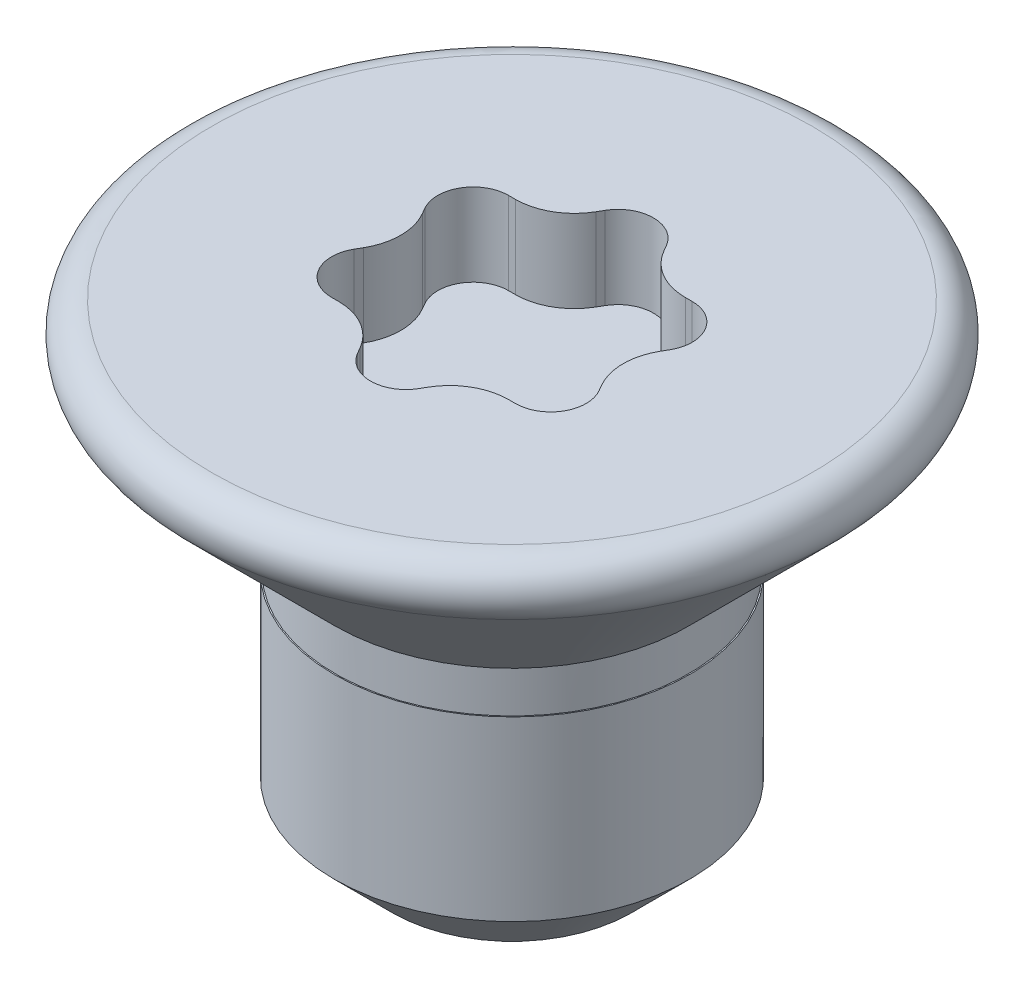
ISO-10303-21;
HEADER;
FILE_DESCRIPTION(('STEP AP214'),'2;1');
FILE_NAME('part.step','',(''),(''),'','','');
FILE_SCHEMA(('AUTOMOTIVE_DESIGN { 1 0 10303 214 1 1 1 1 }'));
ENDSEC;
DATA;
#1=APPLICATION_CONTEXT('core data for automotive mechanical design processes');
#2=APPLICATION_PROTOCOL_DEFINITION('international standard','automotive_design',2000,#1);
#3=PRODUCT_CONTEXT('',#1,'mechanical');
#4=PRODUCT('Part','Part','',(#3));
#5=PRODUCT_RELATED_PRODUCT_CATEGORY('part','',(#4));
#6=PRODUCT_DEFINITION_FORMATION('','',#4);
#7=PRODUCT_DEFINITION_CONTEXT('part definition',#1,'design');
#8=PRODUCT_DEFINITION('design','',#6,#7);
#9=PRODUCT_DEFINITION_SHAPE('','',#8);
#10=(LENGTH_UNIT() NAMED_UNIT(*) SI_UNIT(.MILLI.,.METRE.));
#11=(NAMED_UNIT(*) PLANE_ANGLE_UNIT() SI_UNIT($,.RADIAN.));
#12=(NAMED_UNIT(*) SI_UNIT($,.STERADIAN.) SOLID_ANGLE_UNIT());
#13=UNCERTAINTY_MEASURE_WITH_UNIT(LENGTH_MEASURE(1.E-05),#10,'distance_accuracy_value','');
#14=(GEOMETRIC_REPRESENTATION_CONTEXT(3) GLOBAL_UNCERTAINTY_ASSIGNED_CONTEXT((#13)) GLOBAL_UNIT_ASSIGNED_CONTEXT((#10,
#11,#12)) REPRESENTATION_CONTEXT('',''));
#15=CARTESIAN_POINT('',(0.,0.,0.));
#16=DIRECTION('',(0.,0.,1.));
#17=DIRECTION('',(1.,0.,0.));
#18=AXIS2_PLACEMENT_3D('',#15,#16,#17);
#19=CARTESIAN_POINT('',(0.,-4.,0.));
#20=DIRECTION('',(0.,-1.,0.));
#21=DIRECTION('',(1.,0.,0.));
#22=AXIS2_PLACEMENT_3D('',#19,#20,#21);
#23=PLANE('',#22);
#24=CARTESIAN_POINT('',(0.,-3.99999999996226,0.));
#25=DIRECTION('',(0.,1.,0.));
#26=DIRECTION('',(0.,0.,1.));
#27=AXIS2_PLACEMENT_3D('',#24,#25,#26);
#28=CIRCLE('',#27,1.01414213560247);
#29=CARTESIAN_POINT('',(0.,-3.99999999996226,1.01414213560247));
#30=VERTEX_POINT('',#29);
#31=EDGE_CURVE('E285',#30,#30,#28,.T.);
#32=ORIENTED_EDGE('',*,*,#31,.F.);
#33=EDGE_LOOP('',(#32));
#34=FACE_BOUND('',#33,.T.);
#35=ADVANCED_FACE('F17',(#34),#23,.T.);
#36=CARTESIAN_POINT('',(0.,-3.50414213562544,0.));
#37=DIRECTION('',(0.,1.,0.));
#38=DIRECTION('',(0.,0.,1.));
#39=AXIS2_PLACEMENT_3D('',#36,#37,#38);
#40=CONICAL_SURFACE('',#39,1.50999999993928,0.785398163397448);
#41=ORIENTED_EDGE('',*,*,#31,.T.);
#42=EDGE_LOOP('',(#41));
#43=FACE_BOUND('',#42,.T.);
#44=CARTESIAN_POINT('',(0.,-3.50414213562373,0.));
#45=DIRECTION('',(0.,1.,0.));
#46=DIRECTION('',(0.,0.,1.));
#47=AXIS2_PLACEMENT_3D('',#44,#45,#46);
#48=CIRCLE('',#47,1.51);
#49=CARTESIAN_POINT('',(0.,-3.50414213562373,1.51));
#50=VERTEX_POINT('',#49);
#51=EDGE_CURVE('E282',#50,#50,#48,.T.);
#52=ORIENTED_EDGE('',*,*,#51,.F.);
#53=EDGE_LOOP('',(#52));
#54=FACE_BOUND('',#53,.T.);
#55=ADVANCED_FACE('F747',(#43,#54),#40,.T.);
#56=CARTESIAN_POINT('',(0.,0.,0.));
#57=DIRECTION('',(0.,1.,0.));
#58=DIRECTION('',(0.,0.,1.));
#59=AXIS2_PLACEMENT_3D('',#56,#57,#58);
#60=CYLINDRICAL_SURFACE('',#59,1.51);
#61=ORIENTED_EDGE('',*,*,#51,.T.);
#62=EDGE_LOOP('',(#61));
#63=FACE_BOUND('',#62,.T.);
#64=CARTESIAN_POINT('',(0.,-2.,0.));
#65=DIRECTION('',(0.,1.,0.));
#66=DIRECTION('',(0.,0.,1.));
#67=AXIS2_PLACEMENT_3D('',#64,#65,#66);
#68=CIRCLE('',#67,1.51);
#69=CARTESIAN_POINT('',(0.,-2.,1.51));
#70=VERTEX_POINT('',#69);
#71=EDGE_CURVE('E284',#70,#70,#68,.T.);
#72=ORIENTED_EDGE('',*,*,#71,.F.);
#73=EDGE_LOOP('',(#72));
#74=FACE_BOUND('',#73,.T.);
#75=ADVANCED_FACE('F737',(#63,#74),#60,.T.);
#76=CARTESIAN_POINT('',(-1.5,-2.,0.));
#77=DIRECTION('',(0.,1.,0.));
#78=DIRECTION('',(0.,0.,1.));
#79=AXIS2_PLACEMENT_3D('',#76,#77,#78);
#80=PLANE('',#79);
#81=CARTESIAN_POINT('',(0.,-2.,0.));
#82=DIRECTION('',(0.,1.,0.));
#83=DIRECTION('',(-1.,0.,0.));
#84=AXIS2_PLACEMENT_3D('',#81,#82,#83);
#85=CIRCLE('',#84,1.5);
#86=CARTESIAN_POINT('',(-1.5,-2.,0.));
#87=VERTEX_POINT('',#86);
#88=EDGE_CURVE('E281',#87,#87,#85,.T.);
#89=ORIENTED_EDGE('',*,*,#88,.F.);
#90=EDGE_LOOP('',(#89));
#91=FACE_BOUND('',#90,.T.);
#92=ORIENTED_EDGE('',*,*,#71,.T.);
#93=EDGE_LOOP('',(#92));
#94=FACE_BOUND('',#93,.T.);
#95=ADVANCED_FACE('F727',(#91,#94),#80,.T.);
#96=CARTESIAN_POINT('',(0.,-1.65,0.));
#97=DIRECTION('',(0.,1.,0.));
#98=DIRECTION('',(-1.,0.,0.));
#99=AXIS2_PLACEMENT_3D('',#96,#97,#98);
#100=CYLINDRICAL_SURFACE('',#99,1.5);
#101=CARTESIAN_POINT('',(0.,-1.65000000004056,0.));
#102=DIRECTION('',(0.,1.,0.));
#103=DIRECTION('',(0.,0.,1.));
#104=AXIS2_PLACEMENT_3D('',#101,#102,#103);
#105=CIRCLE('',#104,1.49999999996453);
#106=CARTESIAN_POINT('',(0.,-1.65000000004056,1.49999999996453));
#107=VERTEX_POINT('',#106);
#108=EDGE_CURVE('E278',#107,#107,#105,.T.);
#109=ORIENTED_EDGE('',*,*,#108,.F.);
#110=EDGE_LOOP('',(#109));
#111=FACE_BOUND('',#110,.T.);
#112=ORIENTED_EDGE('',*,*,#88,.T.);
#113=EDGE_LOOP('',(#112));
#114=FACE_BOUND('',#113,.T.);
#115=ADVANCED_FACE('F719',(#111,#114),#100,.T.);
#116=CARTESIAN_POINT('',(0.,-0.426776695405806,0.));
#117=DIRECTION('',(0.,1.,0.));
#118=DIRECTION('',(-1.,0.,0.));
#119=AXIS2_PLACEMENT_3D('',#116,#117,#118);
#120=CONICAL_SURFACE('',#119,2.72322330459929,0.785398163397448);
#121=ORIENTED_EDGE('',*,*,#108,.T.);
#122=EDGE_LOOP('',(#121));
#123=FACE_BOUND('',#122,.T.);
#124=CARTESIAN_POINT('',(0.,-0.426776695296636,0.));
#125=DIRECTION('',(0.,-1.,0.));
#126=DIRECTION('',(0.,0.,-1.));
#127=AXIS2_PLACEMENT_3D('',#124,#125,#126);
#128=CIRCLE('',#127,2.72322330470336);
#129=CARTESIAN_POINT('',(0.,-0.426776695296636,-2.72322330470336));
#130=VERTEX_POINT('',#129);
#131=EDGE_CURVE('E240',#130,#130,#128,.F.);
#132=ORIENTED_EDGE('',*,*,#131,.F.);
#133=EDGE_LOOP('',(#132));
#134=FACE_BOUND('',#133,.T.);
#135=ADVANCED_FACE('F712',(#123,#134),#120,.T.);
#136=CARTESIAN_POINT('',(-0.721687836487033,-0.7,-1.25));
#137=DIRECTION('',(0.,1.,0.));
#138=DIRECTION('',(0.,0.,1.));
#139=AXIS2_PLACEMENT_3D('',#136,#137,#138);
#140=PLANE('',#139);
#141=CARTESIAN_POINT('',(0.,-0.7,-0.900000000000001));
#142=DIRECTION('',(0.,1.,0.));
#143=DIRECTION('',(0.,0.,1.));
#144=AXIS2_PLACEMENT_3D('',#141,#142,#143);
#145=CIRCLE('',#144,0.3);
#146=CARTESIAN_POINT('',(0.259807621135331,-0.7,-1.05));
#147=VERTEX_POINT('',#146);
#148=CARTESIAN_POINT('',(-0.259807621135332,-0.7,-1.05));
#149=VERTEX_POINT('',#148);
#150=EDGE_CURVE('E238',#147,#149,#145,.T.);
#151=ORIENTED_EDGE('',*,*,#150,.T.);
#152=DIRECTION('',(0.5,0.,-0.866025403784438));
#153=VECTOR('',#152,1.);
#154=CARTESIAN_POINT('',(-0.288675134594814,-0.7,-1.));
#155=LINE('',#154,#153);
#156=CARTESIAN_POINT('',(-0.288675134594814,-0.7,-1.));
#157=VERTEX_POINT('',#156);
#158=EDGE_CURVE('E230',#157,#149,#155,.T.);
#159=ORIENTED_EDGE('',*,*,#158,.F.);
#160=CARTESIAN_POINT('',(-0.721687836487033,-0.7,-1.25));
#161=DIRECTION('',(0.,1.,0.));
#162=DIRECTION('',(0.,0.,1.));
#163=AXIS2_PLACEMENT_3D('',#160,#161,#162);
#164=CIRCLE('',#163,0.5);
#165=CARTESIAN_POINT('',(-0.721687836487033,-0.7,-0.75));
#166=VERTEX_POINT('',#165);
#167=EDGE_CURVE('E328',#166,#157,#164,.T.);
#168=ORIENTED_EDGE('',*,*,#167,.F.);
#169=DIRECTION('',(1.,0.,0.));
#170=VECTOR('',#169,1.);
#171=CARTESIAN_POINT('',(-0.779422863405995,-0.7,-0.75));
#172=LINE('',#171,#170);
#173=CARTESIAN_POINT('',(-0.779422863405995,-0.7,-0.75));
#174=VERTEX_POINT('',#173);
#175=EDGE_CURVE('E180',#174,#166,#172,.T.);
#176=ORIENTED_EDGE('',*,*,#175,.F.);
#177=CARTESIAN_POINT('',(-0.779422863405995,-0.7,-0.45));
#178=DIRECTION('',(0.,1.,0.));
#179=DIRECTION('',(0.,0.,1.));
#180=AXIS2_PLACEMENT_3D('',#177,#178,#179);
#181=CIRCLE('',#180,0.3);
#182=CARTESIAN_POINT('',(-1.03923048454133,-0.7,-0.3));
#183=VERTEX_POINT('',#182);
#184=EDGE_CURVE('E194',#174,#183,#181,.T.);
#185=ORIENTED_EDGE('',*,*,#184,.T.);
#186=DIRECTION('',(-0.500000000000001,0.,-0.866025403784438));
#187=VECTOR('',#186,1.);
#188=CARTESIAN_POINT('',(-1.01036297108185,-0.7,-0.25));
#189=LINE('',#188,#187);
#190=CARTESIAN_POINT('',(-1.01036297108185,-0.7,-0.25));
#191=VERTEX_POINT('',#190);
#192=EDGE_CURVE('E186',#191,#183,#189,.T.);
#193=ORIENTED_EDGE('',*,*,#192,.F.);
#194=CARTESIAN_POINT('',(-1.44337567297407,-0.7,0.));
#195=DIRECTION('',(0.,1.,0.));
#196=DIRECTION('',(0.,0.,1.));
#197=AXIS2_PLACEMENT_3D('',#194,#195,#196);
#198=CIRCLE('',#197,0.5);
#199=CARTESIAN_POINT('',(-1.01036297108185,-0.7,0.249999999999999));
#200=VERTEX_POINT('',#199);
#201=EDGE_CURVE('E206',#200,#191,#198,.T.);
#202=ORIENTED_EDGE('',*,*,#201,.F.);
#203=DIRECTION('',(0.499999999999995,0.,-0.866025403784441));
#204=VECTOR('',#203,1.);
#205=CARTESIAN_POINT('',(-1.03923048454133,-0.7,0.300000000000001));
#206=LINE('',#205,#204);
#207=CARTESIAN_POINT('',(-1.03923048454133,-0.7,0.300000000000001));
#208=VERTEX_POINT('',#207);
#209=EDGE_CURVE('E273',#208,#200,#206,.T.);
#210=ORIENTED_EDGE('',*,*,#209,.F.);
#211=CARTESIAN_POINT('',(-0.779422863405996,-0.7,0.450000000000001));
#212=DIRECTION('',(0.,1.,0.));
#213=DIRECTION('',(0.,0.,1.));
#214=AXIS2_PLACEMENT_3D('',#211,#212,#213);
#215=CIRCLE('',#214,0.3);
#216=CARTESIAN_POINT('',(-0.779422863405997,-0.7,0.75));
#217=VERTEX_POINT('',#216);
#218=EDGE_CURVE('E272',#208,#217,#215,.T.);
#219=ORIENTED_EDGE('',*,*,#218,.T.);
#220=DIRECTION('',(-1.,0.,0.));
#221=VECTOR('',#220,1.);
#222=CARTESIAN_POINT('',(-0.721687836487033,-0.7,0.750000000000001));
#223=LINE('',#222,#221);
#224=CARTESIAN_POINT('',(-0.721687836487031,-0.7,0.750000000000001));
#225=VERTEX_POINT('',#224);
#226=EDGE_CURVE('E269',#225,#217,#223,.T.);
#227=ORIENTED_EDGE('',*,*,#226,.F.);
#228=CARTESIAN_POINT('',(-0.721687836487033,-0.7,1.25));
#229=DIRECTION('',(0.,1.,0.));
#230=DIRECTION('',(0.,0.,1.));
#231=AXIS2_PLACEMENT_3D('',#228,#229,#230);
#232=CIRCLE('',#231,0.5);
#233=CARTESIAN_POINT('',(-0.288675134594814,-0.7,1.));
#234=VERTEX_POINT('',#233);
#235=EDGE_CURVE('E348',#234,#225,#232,.T.);
#236=ORIENTED_EDGE('',*,*,#235,.F.);
#237=DIRECTION('',(-0.500000000000002,0.,-0.866025403784438));
#238=VECTOR('',#237,1.);
#239=CARTESIAN_POINT('',(-0.259807621135332,-0.7,1.05));
#240=LINE('',#239,#238);
#241=CARTESIAN_POINT('',(-0.259807621135331,-0.7,1.05));
#242=VERTEX_POINT('',#241);
#243=EDGE_CURVE('E265',#242,#234,#240,.T.);
#244=ORIENTED_EDGE('',*,*,#243,.F.);
#245=CARTESIAN_POINT('',(0.,-0.7,0.900000000000001));
#246=DIRECTION('',(0.,1.,0.));
#247=DIRECTION('',(0.,0.,1.));
#248=AXIS2_PLACEMENT_3D('',#245,#246,#247);
#249=CIRCLE('',#248,0.3);
#250=CARTESIAN_POINT('',(0.259807621135332,-0.7,1.05));
#251=VERTEX_POINT('',#250);
#252=EDGE_CURVE('E264',#242,#251,#249,.T.);
#253=ORIENTED_EDGE('',*,*,#252,.T.);
#254=DIRECTION('',(-0.499999999999999,0.,0.866025403784439));
#255=VECTOR('',#254,1.);
#256=CARTESIAN_POINT('',(0.288675134594813,-0.7,1.));
#257=LINE('',#256,#255);
#258=CARTESIAN_POINT('',(0.288675134594813,-0.7,1.));
#259=VERTEX_POINT('',#258);
#260=EDGE_CURVE('E261',#259,#251,#257,.T.);
#261=ORIENTED_EDGE('',*,*,#260,.F.);
#262=CARTESIAN_POINT('',(0.721687836487033,-0.7,1.25));
#263=DIRECTION('',(0.,1.,0.));
#264=DIRECTION('',(0.,0.,1.));
#265=AXIS2_PLACEMENT_3D('',#262,#263,#264);
#266=CIRCLE('',#265,0.5);
#267=CARTESIAN_POINT('',(0.721687836487032,-0.7,0.750000000000001));
#268=VERTEX_POINT('',#267);
#269=EDGE_CURVE('E343',#268,#259,#266,.T.);
#270=ORIENTED_EDGE('',*,*,#269,.F.);
#271=DIRECTION('',(-1.,0.,0.));
#272=VECTOR('',#271,1.);
#273=CARTESIAN_POINT('',(0.779422863405995,-0.7,0.750000000000001));
#274=LINE('',#273,#272);
#275=CARTESIAN_POINT('',(0.779422863405995,-0.7,0.750000000000001));
#276=VERTEX_POINT('',#275);
#277=EDGE_CURVE('E257',#276,#268,#274,.T.);
#278=ORIENTED_EDGE('',*,*,#277,.F.);
#279=CARTESIAN_POINT('',(0.779422863405995,-0.7,0.450000000000001));
#280=DIRECTION('',(0.,1.,0.));
#281=DIRECTION('',(0.,0.,1.));
#282=AXIS2_PLACEMENT_3D('',#279,#280,#281);
#283=CIRCLE('',#282,0.3);
#284=CARTESIAN_POINT('',(1.03923048454133,-0.7,0.300000000000001));
#285=VERTEX_POINT('',#284);
#286=EDGE_CURVE('E256',#276,#285,#283,.T.);
#287=ORIENTED_EDGE('',*,*,#286,.T.);
#288=DIRECTION('',(0.499999999999997,0.,0.866025403784441));
#289=VECTOR('',#288,1.);
#290=CARTESIAN_POINT('',(1.01036297108185,-0.7,0.250000000000001));
#291=LINE('',#290,#289);
#292=CARTESIAN_POINT('',(1.01036297108185,-0.7,0.25));
#293=VERTEX_POINT('',#292);
#294=EDGE_CURVE('E253',#293,#285,#291,.T.);
#295=ORIENTED_EDGE('',*,*,#294,.F.);
#296=CARTESIAN_POINT('',(1.44337567297406,-0.7,0.));
#297=DIRECTION('',(0.,1.,0.));
#298=DIRECTION('',(0.,0.,1.));
#299=AXIS2_PLACEMENT_3D('',#296,#297,#298);
#300=CIRCLE('',#299,0.5);
#301=CARTESIAN_POINT('',(1.01036297108185,-0.7,-0.25));
#302=VERTEX_POINT('',#301);
#303=EDGE_CURVE('E338',#302,#293,#300,.T.);
#304=ORIENTED_EDGE('',*,*,#303,.F.);
#305=DIRECTION('',(-0.500000000000003,0.,0.866025403784437));
#306=VECTOR('',#305,1.);
#307=CARTESIAN_POINT('',(1.03923048454133,-0.7,-0.3));
#308=LINE('',#307,#306);
#309=CARTESIAN_POINT('',(1.03923048454133,-0.7,-0.299999999999999));
#310=VERTEX_POINT('',#309);
#311=EDGE_CURVE('E249',#310,#302,#308,.T.);
#312=ORIENTED_EDGE('',*,*,#311,.F.);
#313=CARTESIAN_POINT('',(0.779422863405996,-0.7,-0.45));
#314=DIRECTION('',(0.,1.,0.));
#315=DIRECTION('',(0.,0.,1.));
#316=AXIS2_PLACEMENT_3D('',#313,#314,#315);
#317=CIRCLE('',#316,0.3);
#318=CARTESIAN_POINT('',(0.779422863405996,-0.7,-0.749999999999999));
#319=VERTEX_POINT('',#318);
#320=EDGE_CURVE('E248',#310,#319,#317,.T.);
#321=ORIENTED_EDGE('',*,*,#320,.T.);
#322=DIRECTION('',(1.,0.,0.));
#323=VECTOR('',#322,1.);
#324=CARTESIAN_POINT('',(0.721687836487033,-0.7,-0.749999999999999));
#325=LINE('',#324,#323);
#326=CARTESIAN_POINT('',(0.721687836487033,-0.7,-0.75));
#327=VERTEX_POINT('',#326);
#328=EDGE_CURVE('E245',#327,#319,#325,.T.);
#329=ORIENTED_EDGE('',*,*,#328,.F.);
#330=CARTESIAN_POINT('',(0.721687836487033,-0.7,-1.25));
#331=DIRECTION('',(0.,1.,0.));
#332=DIRECTION('',(0.,0.,1.));
#333=AXIS2_PLACEMENT_3D('',#330,#331,#332);
#334=CIRCLE('',#333,0.5);
#335=CARTESIAN_POINT('',(0.288675134594814,-0.7,-0.999999999999999));
#336=VERTEX_POINT('',#335);
#337=EDGE_CURVE('E333',#336,#327,#334,.T.);
#338=ORIENTED_EDGE('',*,*,#337,.F.);
#339=DIRECTION('',(0.500000000000004,0.,0.866025403784436));
#340=VECTOR('',#339,1.);
#341=CARTESIAN_POINT('',(0.259807621135331,-0.7,-1.05));
#342=LINE('',#341,#340);
#343=EDGE_CURVE('E241',#147,#336,#342,.T.);
#344=ORIENTED_EDGE('',*,*,#343,.F.);
#345=EDGE_LOOP('',(#151,#159,#168,#176,#185,#193,#202,#210,#219,#227,#236,#244,#253,#261,#270,
#278,#287,#295,#304,#312,#321,#329,#338,#344));
#346=FACE_BOUND('',#345,.T.);
#347=ADVANCED_FACE('F197',(#346),#140,.T.);
#348=CARTESIAN_POINT('',(0.,-0.25,0.));
#349=DIRECTION('',(0.,-1.,0.));
#350=DIRECTION('',(0.,0.,-1.));
#351=AXIS2_PLACEMENT_3D('',#348,#349,#350);
#352=TOROIDAL_SURFACE('',#351,2.54644660940672,0.25);
#353=CARTESIAN_POINT('',(0.,0.,0.));
#354=DIRECTION('',(0.,-1.,0.));
#355=DIRECTION('',(0.,0.,-1.));
#356=AXIS2_PLACEMENT_3D('',#353,#354,#355);
#357=CIRCLE('',#356,2.54644660940672);
#358=CARTESIAN_POINT('',(0.,0.,-2.54644660940672));
#359=VERTEX_POINT('',#358);
#360=CARTESIAN_POINT('',(0.,0.,2.54644660940672));
#361=VERTEX_POINT('',#360);
#362=EDGE_CURVE('E360',#359,#361,#357,.T.);
#363=ORIENTED_EDGE('',*,*,#362,.T.);
#364=CARTESIAN_POINT('',(0.,0.,0.));
#365=DIRECTION('',(0.,-1.,0.));
#366=DIRECTION('',(0.,0.,1.));
#367=AXIS2_PLACEMENT_3D('',#364,#365,#366);
#368=CIRCLE('',#367,2.54644660940672);
#369=EDGE_CURVE('E363',#361,#359,#368,.T.);
#370=ORIENTED_EDGE('',*,*,#369,.T.);
#371=EDGE_LOOP('',(#363,#370));
#372=FACE_BOUND('',#371,.T.);
#373=ORIENTED_EDGE('',*,*,#131,.T.);
#374=EDGE_LOOP('',(#373));
#375=FACE_BOUND('',#374,.T.);
#376=ADVANCED_FACE('F217',(#372,#375),#352,.T.);
#377=CARTESIAN_POINT('',(-0.779422863405995,-0.7,-0.75));
#378=DIRECTION('',(0.,0.,1.));
#379=DIRECTION('',(1.,0.,0.));
#380=AXIS2_PLACEMENT_3D('',#377,#378,#379);
#381=PLANE('',#380);
#382=ORIENTED_EDGE('',*,*,#175,.T.);
#383=DIRECTION('',(0.,1.,0.));
#384=VECTOR('',#383,1.);
#385=CARTESIAN_POINT('',(-0.721687836487033,-0.7,-0.75));
#386=LINE('',#385,#384);
#387=CARTESIAN_POINT('',(-0.721687836487033,0.,-0.75));
#388=VERTEX_POINT('',#387);
#389=EDGE_CURVE('E330',#388,#166,#386,.F.);
#390=ORIENTED_EDGE('',*,*,#389,.F.);
#391=DIRECTION('',(1.,0.,0.));
#392=VECTOR('',#391,1.);
#393=CARTESIAN_POINT('',(0.,0.,-0.75));
#394=LINE('',#393,#392);
#395=CARTESIAN_POINT('',(-0.779422863405995,0.,-0.75));
#396=VERTEX_POINT('',#395);
#397=EDGE_CURVE('E327',#388,#396,#394,.F.);
#398=ORIENTED_EDGE('',*,*,#397,.T.);
#399=DIRECTION('',(0.,1.,0.));
#400=VECTOR('',#399,1.);
#401=CARTESIAN_POINT('',(-0.779422863405995,-0.7,-0.75));
#402=LINE('',#401,#400);
#403=EDGE_CURVE('E200',#396,#174,#402,.F.);
#404=ORIENTED_EDGE('',*,*,#403,.T.);
#405=EDGE_LOOP('',(#382,#390,#398,#404));
#406=FACE_BOUND('',#405,.T.);
#407=ADVANCED_FACE('F222',(#406),#381,.T.);
#408=CARTESIAN_POINT('',(-0.779422863405995,-0.7,-0.45));
#409=DIRECTION('',(0.,1.,0.));
#410=DIRECTION('',(0.,0.,1.));
#411=AXIS2_PLACEMENT_3D('',#408,#409,#410);
#412=CYLINDRICAL_SURFACE('',#411,0.3);
#413=DIRECTION('',(0.,1.,0.));
#414=VECTOR('',#413,1.);
#415=CARTESIAN_POINT('',(-1.03923048454133,-0.7,-0.3));
#416=LINE('',#415,#414);
#417=CARTESIAN_POINT('',(-1.03923048454133,0.,-0.3));
#418=VERTEX_POINT('',#417);
#419=EDGE_CURVE('E190',#183,#418,#416,.T.);
#420=ORIENTED_EDGE('',*,*,#419,.F.);
#421=ORIENTED_EDGE('',*,*,#184,.F.);
#422=ORIENTED_EDGE('',*,*,#403,.F.);
#423=CARTESIAN_POINT('',(-0.779422863405995,0.,-0.45));
#424=DIRECTION('',(0.,1.,0.));
#425=DIRECTION('',(0.,0.,1.));
#426=AXIS2_PLACEMENT_3D('',#423,#424,#425);
#427=CIRCLE('',#426,0.3);
#428=EDGE_CURVE('E205',#396,#418,#427,.T.);
#429=ORIENTED_EDGE('',*,*,#428,.T.);
#430=EDGE_LOOP('',(#420,#421,#422,#429));
#431=FACE_BOUND('',#430,.T.);
#432=ADVANCED_FACE('F203',(#431),#412,.F.);
#433=CARTESIAN_POINT('',(-1.01036297108185,-0.7,-0.25));
#434=DIRECTION('',(0.866025403784438,0.,-0.500000000000001));
#435=DIRECTION('',(-0.500000000000001,0.,-0.866025403784438));
#436=AXIS2_PLACEMENT_3D('',#433,#434,#435);
#437=PLANE('',#436);
#438=ORIENTED_EDGE('',*,*,#192,.T.);
#439=ORIENTED_EDGE('',*,*,#419,.T.);
#440=DIRECTION('',(0.499999999999999,0.,0.866025403784439));
#441=VECTOR('',#440,1.);
#442=CARTESIAN_POINT('',(-1.03923048454133,0.,-0.3));
#443=LINE('',#442,#441);
#444=CARTESIAN_POINT('',(-1.01036297108185,0.,-0.249999999999999));
#445=VERTEX_POINT('',#444);
#446=EDGE_CURVE('E325',#418,#445,#443,.T.);
#447=ORIENTED_EDGE('',*,*,#446,.T.);
#448=DIRECTION('',(0.,1.,0.));
#449=VECTOR('',#448,1.);
#450=CARTESIAN_POINT('',(-1.01036297108185,-0.7,-0.25));
#451=LINE('',#450,#449);
#452=EDGE_CURVE('E192',#191,#445,#451,.T.);
#453=ORIENTED_EDGE('',*,*,#452,.F.);
#454=EDGE_LOOP('',(#438,#439,#447,#453));
#455=FACE_BOUND('',#454,.T.);
#456=ADVANCED_FACE('F187',(#455),#437,.T.);
#457=CARTESIAN_POINT('',(-1.44337567297407,-0.7,0.));
#458=DIRECTION('',(0.,1.,0.));
#459=DIRECTION('',(0.,0.,1.));
#460=AXIS2_PLACEMENT_3D('',#457,#458,#459);
#461=CYLINDRICAL_SURFACE('',#460,0.5);
#462=ORIENTED_EDGE('',*,*,#201,.T.);
#463=ORIENTED_EDGE('',*,*,#452,.T.);
#464=CARTESIAN_POINT('',(-1.44337567297407,0.,0.));
#465=DIRECTION('',(0.,1.,0.));
#466=DIRECTION('',(0.,0.,1.));
#467=AXIS2_PLACEMENT_3D('',#464,#465,#466);
#468=CIRCLE('',#467,0.5);
#469=CARTESIAN_POINT('',(-1.01036297108185,0.,0.249999999999999));
#470=VERTEX_POINT('',#469);
#471=EDGE_CURVE('E322',#445,#470,#468,.F.);
#472=ORIENTED_EDGE('',*,*,#471,.T.);
#473=DIRECTION('',(0.,1.,0.));
#474=VECTOR('',#473,1.);
#475=CARTESIAN_POINT('',(-1.01036297108185,-0.7,0.25));
#476=LINE('',#475,#474);
#477=EDGE_CURVE('E274',#200,#470,#476,.T.);
#478=ORIENTED_EDGE('',*,*,#477,.F.);
#479=EDGE_LOOP('',(#462,#463,#472,#478));
#480=FACE_BOUND('',#479,.T.);
#481=ADVANCED_FACE('F408',(#480),#461,.T.);
#482=CARTESIAN_POINT('',(-1.03923048454133,-0.7,0.300000000000001));
#483=DIRECTION('',(0.866025403784441,0.,0.499999999999995));
#484=DIRECTION('',(0.499999999999995,0.,-0.866025403784441));
#485=AXIS2_PLACEMENT_3D('',#482,#483,#484);
#486=PLANE('',#485);
#487=ORIENTED_EDGE('',*,*,#209,.T.);
#488=ORIENTED_EDGE('',*,*,#477,.T.);
#489=DIRECTION('',(-0.499999999999995,0.,0.866025403784441));
#490=VECTOR('',#489,1.);
#491=CARTESIAN_POINT('',(-1.01036297108185,0.,0.25));
#492=LINE('',#491,#490);
#493=CARTESIAN_POINT('',(-1.03923048454133,0.,0.300000000000001));
#494=VERTEX_POINT('',#493);
#495=EDGE_CURVE('E321',#470,#494,#492,.T.);
#496=ORIENTED_EDGE('',*,*,#495,.T.);
#497=DIRECTION('',(0.,1.,0.));
#498=VECTOR('',#497,1.);
#499=CARTESIAN_POINT('',(-1.03923048454133,-0.7,0.300000000000001));
#500=LINE('',#499,#498);
#501=EDGE_CURVE('E351',#494,#208,#500,.F.);
#502=ORIENTED_EDGE('',*,*,#501,.T.);
#503=EDGE_LOOP('',(#487,#488,#496,#502));
#504=FACE_BOUND('',#503,.T.);
#505=ADVANCED_FACE('F399',(#504),#486,.T.);
#506=CARTESIAN_POINT('',(-0.779422863405996,-0.7,0.450000000000001));
#507=DIRECTION('',(0.,1.,0.));
#508=DIRECTION('',(0.,0.,1.));
#509=AXIS2_PLACEMENT_3D('',#506,#507,#508);
#510=CYLINDRICAL_SURFACE('',#509,0.3);
#511=DIRECTION('',(0.,1.,0.));
#512=VECTOR('',#511,1.);
#513=CARTESIAN_POINT('',(-0.779422863405996,-0.7,0.75));
#514=LINE('',#513,#512);
#515=CARTESIAN_POINT('',(-0.779422863405996,0.,0.75));
#516=VERTEX_POINT('',#515);
#517=EDGE_CURVE('E271',#217,#516,#514,.T.);
#518=ORIENTED_EDGE('',*,*,#517,.F.);
#519=ORIENTED_EDGE('',*,*,#218,.F.);
#520=ORIENTED_EDGE('',*,*,#501,.F.);
#521=CARTESIAN_POINT('',(-0.779422863405996,0.,0.450000000000001));
#522=DIRECTION('',(0.,1.,0.));
#523=DIRECTION('',(0.,0.,1.));
#524=AXIS2_PLACEMENT_3D('',#521,#522,#523);
#525=CIRCLE('',#524,0.3);
#526=EDGE_CURVE('E318',#494,#516,#525,.T.);
#527=ORIENTED_EDGE('',*,*,#526,.T.);
#528=EDGE_LOOP('',(#518,#519,#520,#527));
#529=FACE_BOUND('',#528,.T.);
#530=ADVANCED_FACE('F413',(#529),#510,.F.);
#531=CARTESIAN_POINT('',(-0.721687836487033,-0.7,0.750000000000001));
#532=DIRECTION('',(0.,0.,-1.));
#533=DIRECTION('',(-1.,0.,0.));
#534=AXIS2_PLACEMENT_3D('',#531,#532,#533);
#535=PLANE('',#534);
#536=ORIENTED_EDGE('',*,*,#226,.T.);
#537=ORIENTED_EDGE('',*,*,#517,.T.);
#538=DIRECTION('',(1.,0.,0.));
#539=VECTOR('',#538,1.);
#540=CARTESIAN_POINT('',(0.,0.,0.75));
#541=LINE('',#540,#539);
#542=CARTESIAN_POINT('',(-0.721687836487033,0.,0.75));
#543=VERTEX_POINT('',#542);
#544=EDGE_CURVE('E317',#516,#543,#541,.T.);
#545=ORIENTED_EDGE('',*,*,#544,.T.);
#546=DIRECTION('',(0.,1.,0.));
#547=VECTOR('',#546,1.);
#548=CARTESIAN_POINT('',(-0.721687836487033,-0.7,0.750000000000001));
#549=LINE('',#548,#547);
#550=EDGE_CURVE('E268',#225,#543,#549,.T.);
#551=ORIENTED_EDGE('',*,*,#550,.F.);
#552=EDGE_LOOP('',(#536,#537,#545,#551));
#553=FACE_BOUND('',#552,.T.);
#554=ADVANCED_FACE('F416',(#553),#535,.T.);
#555=CARTESIAN_POINT('',(-0.721687836487033,-0.7,1.25));
#556=DIRECTION('',(0.,1.,0.));
#557=DIRECTION('',(0.,0.,1.));
#558=AXIS2_PLACEMENT_3D('',#555,#556,#557);
#559=CYLINDRICAL_SURFACE('',#558,0.5);
#560=ORIENTED_EDGE('',*,*,#235,.T.);
#561=ORIENTED_EDGE('',*,*,#550,.T.);
#562=CARTESIAN_POINT('',(-0.721687836487033,0.,1.25));
#563=DIRECTION('',(0.,1.,0.));
#564=DIRECTION('',(0.,0.,1.));
#565=AXIS2_PLACEMENT_3D('',#562,#563,#564);
#566=CIRCLE('',#565,0.5);
#567=CARTESIAN_POINT('',(-0.288675134594814,0.,1.));
#568=VERTEX_POINT('',#567);
#569=EDGE_CURVE('E314',#543,#568,#566,.F.);
#570=ORIENTED_EDGE('',*,*,#569,.T.);
#571=DIRECTION('',(0.,1.,0.));
#572=VECTOR('',#571,1.);
#573=CARTESIAN_POINT('',(-0.288675134594813,-0.7,1.));
#574=LINE('',#573,#572);
#575=EDGE_CURVE('E267',#234,#568,#574,.T.);
#576=ORIENTED_EDGE('',*,*,#575,.F.);
#577=EDGE_LOOP('',(#560,#561,#570,#576));
#578=FACE_BOUND('',#577,.T.);
#579=ADVANCED_FACE('F472',(#578),#559,.T.);
#580=CARTESIAN_POINT('',(-0.259807621135332,-0.7,1.05));
#581=DIRECTION('',(0.866025403784438,0.,-0.500000000000002));
#582=DIRECTION('',(-0.500000000000002,0.,-0.866025403784438));
#583=AXIS2_PLACEMENT_3D('',#580,#581,#582);
#584=PLANE('',#583);
#585=ORIENTED_EDGE('',*,*,#243,.T.);
#586=ORIENTED_EDGE('',*,*,#575,.T.);
#587=DIRECTION('',(0.500000000000002,0.,0.866025403784438));
#588=VECTOR('',#587,1.);
#589=CARTESIAN_POINT('',(-0.288675134594813,0.,1.));
#590=LINE('',#589,#588);
#591=CARTESIAN_POINT('',(-0.259807621135331,0.,1.05));
#592=VERTEX_POINT('',#591);
#593=EDGE_CURVE('E313',#568,#592,#590,.T.);
#594=ORIENTED_EDGE('',*,*,#593,.T.);
#595=DIRECTION('',(0.,1.,0.));
#596=VECTOR('',#595,1.);
#597=CARTESIAN_POINT('',(-0.259807621135332,-0.7,1.05));
#598=LINE('',#597,#596);
#599=EDGE_CURVE('E347',#592,#242,#598,.F.);
#600=ORIENTED_EDGE('',*,*,#599,.T.);
#601=EDGE_LOOP('',(#585,#586,#594,#600));
#602=FACE_BOUND('',#601,.T.);
#603=ADVANCED_FACE('F469',(#602),#584,.T.);
#604=CARTESIAN_POINT('',(0.,-0.7,0.900000000000001));
#605=DIRECTION('',(0.,1.,0.));
#606=DIRECTION('',(0.,0.,1.));
#607=AXIS2_PLACEMENT_3D('',#604,#605,#606);
#608=CYLINDRICAL_SURFACE('',#607,0.3);
#609=ORIENTED_EDGE('',*,*,#252,.F.);
#610=ORIENTED_EDGE('',*,*,#599,.F.);
#611=CARTESIAN_POINT('',(0.,0.,0.900000000000001));
#612=DIRECTION('',(0.,1.,0.));
#613=DIRECTION('',(0.,0.,1.));
#614=AXIS2_PLACEMENT_3D('',#611,#612,#613);
#615=CIRCLE('',#614,0.3);
#616=CARTESIAN_POINT('',(0.259807621135332,0.,1.05));
#617=VERTEX_POINT('',#616);
#618=EDGE_CURVE('E311',#592,#617,#615,.T.);
#619=ORIENTED_EDGE('',*,*,#618,.T.);
#620=DIRECTION('',(0.,1.,0.));
#621=VECTOR('',#620,1.);
#622=CARTESIAN_POINT('',(0.259807621135332,-0.7,1.05));
#623=LINE('',#622,#621);
#624=EDGE_CURVE('E263',#251,#617,#623,.T.);
#625=ORIENTED_EDGE('',*,*,#624,.F.);
#626=EDGE_LOOP('',(#609,#610,#619,#625));
#627=FACE_BOUND('',#626,.T.);
#628=ADVANCED_FACE('F467',(#627),#608,.F.);
#629=CARTESIAN_POINT('',(0.288675134594813,-0.7,1.));
#630=DIRECTION('',(-0.866025403784439,0.,-0.499999999999999));
#631=DIRECTION('',(-0.499999999999999,0.,0.866025403784439));
#632=AXIS2_PLACEMENT_3D('',#629,#630,#631);
#633=PLANE('',#632);
#634=ORIENTED_EDGE('',*,*,#260,.T.);
#635=ORIENTED_EDGE('',*,*,#624,.T.);
#636=DIRECTION('',(0.499999999999997,0.,-0.86602540378444));
#637=VECTOR('',#636,1.);
#638=CARTESIAN_POINT('',(0.259807621135332,0.,1.05));
#639=LINE('',#638,#637);
#640=CARTESIAN_POINT('',(0.288675134594813,0.,1.));
#641=VERTEX_POINT('',#640);
#642=EDGE_CURVE('E310',#617,#641,#639,.T.);
#643=ORIENTED_EDGE('',*,*,#642,.T.);
#644=DIRECTION('',(0.,1.,0.));
#645=VECTOR('',#644,1.);
#646=CARTESIAN_POINT('',(0.288675134594814,-0.7,1.));
#647=LINE('',#646,#645);
#648=EDGE_CURVE('E260',#259,#641,#647,.T.);
#649=ORIENTED_EDGE('',*,*,#648,.F.);
#650=EDGE_LOOP('',(#634,#635,#643,#649));
#651=FACE_BOUND('',#650,.T.);
#652=ADVANCED_FACE('F452',(#651),#633,.T.);
#653=CARTESIAN_POINT('',(0.721687836487033,-0.7,1.25));
#654=DIRECTION('',(0.,1.,0.));
#655=DIRECTION('',(0.,0.,1.));
#656=AXIS2_PLACEMENT_3D('',#653,#654,#655);
#657=CYLINDRICAL_SURFACE('',#656,0.5);
#658=ORIENTED_EDGE('',*,*,#269,.T.);
#659=ORIENTED_EDGE('',*,*,#648,.T.);
#660=CARTESIAN_POINT('',(0.721687836487033,0.,1.25));
#661=DIRECTION('',(0.,1.,0.));
#662=DIRECTION('',(0.,0.,1.));
#663=AXIS2_PLACEMENT_3D('',#660,#661,#662);
#664=CIRCLE('',#663,0.5);
#665=CARTESIAN_POINT('',(0.721687836487033,0.,0.750000000000001));
#666=VERTEX_POINT('',#665);
#667=EDGE_CURVE('E307',#641,#666,#664,.F.);
#668=ORIENTED_EDGE('',*,*,#667,.T.);
#669=DIRECTION('',(0.,1.,0.));
#670=VECTOR('',#669,1.);
#671=CARTESIAN_POINT('',(0.721687836487033,-0.7,0.750000000000001));
#672=LINE('',#671,#670);
#673=EDGE_CURVE('E259',#268,#666,#672,.T.);
#674=ORIENTED_EDGE('',*,*,#673,.F.);
#675=EDGE_LOOP('',(#658,#659,#668,#674));
#676=FACE_BOUND('',#675,.T.);
#677=ADVANCED_FACE('F461',(#676),#657,.T.);
#678=CARTESIAN_POINT('',(0.779422863405995,-0.7,0.750000000000001));
#679=DIRECTION('',(0.,0.,-1.));
#680=DIRECTION('',(-1.,0.,0.));
#681=AXIS2_PLACEMENT_3D('',#678,#679,#680);
#682=PLANE('',#681);
#683=ORIENTED_EDGE('',*,*,#277,.T.);
#684=ORIENTED_EDGE('',*,*,#673,.T.);
#685=DIRECTION('',(1.,0.,0.));
#686=VECTOR('',#685,1.);
#687=CARTESIAN_POINT('',(0.,0.,0.750000000000001));
#688=LINE('',#687,#686);
#689=CARTESIAN_POINT('',(0.779422863405995,0.,0.750000000000001));
#690=VERTEX_POINT('',#689);
#691=EDGE_CURVE('E306',#666,#690,#688,.T.);
#692=ORIENTED_EDGE('',*,*,#691,.T.);
#693=DIRECTION('',(0.,1.,0.));
#694=VECTOR('',#693,1.);
#695=CARTESIAN_POINT('',(0.779422863405995,-0.7,0.750000000000001));
#696=LINE('',#695,#694);
#697=EDGE_CURVE('E342',#690,#276,#696,.F.);
#698=ORIENTED_EDGE('',*,*,#697,.T.);
#699=EDGE_LOOP('',(#683,#684,#692,#698));
#700=FACE_BOUND('',#699,.T.);
#701=ADVANCED_FACE('F535',(#700),#682,.T.);
#702=CARTESIAN_POINT('',(0.779422863405995,-0.7,0.450000000000001));
#703=DIRECTION('',(0.,1.,0.));
#704=DIRECTION('',(0.,0.,1.));
#705=AXIS2_PLACEMENT_3D('',#702,#703,#704);
#706=CYLINDRICAL_SURFACE('',#705,0.3);
#707=DIRECTION('',(0.,1.,0.));
#708=VECTOR('',#707,1.);
#709=CARTESIAN_POINT('',(1.03923048454133,-0.7,0.300000000000001));
#710=LINE('',#709,#708);
#711=CARTESIAN_POINT('',(1.03923048454133,0.,0.300000000000001));
#712=VERTEX_POINT('',#711);
#713=EDGE_CURVE('E255',#285,#712,#710,.T.);
#714=ORIENTED_EDGE('',*,*,#713,.F.);
#715=ORIENTED_EDGE('',*,*,#286,.F.);
#716=ORIENTED_EDGE('',*,*,#697,.F.);
#717=CARTESIAN_POINT('',(0.779422863405995,0.,0.450000000000001));
#718=DIRECTION('',(0.,1.,0.));
#719=DIRECTION('',(0.,0.,1.));
#720=AXIS2_PLACEMENT_3D('',#717,#718,#719);
#721=CIRCLE('',#720,0.3);
#722=EDGE_CURVE('E303',#690,#712,#721,.T.);
#723=ORIENTED_EDGE('',*,*,#722,.T.);
#724=EDGE_LOOP('',(#714,#715,#716,#723));
#725=FACE_BOUND('',#724,.T.);
#726=ADVANCED_FACE('F531',(#725),#706,.F.);
#727=CARTESIAN_POINT('',(1.01036297108185,-0.7,0.250000000000001));
#728=DIRECTION('',(-0.866025403784441,0.,0.499999999999997));
#729=DIRECTION('',(0.499999999999997,0.,0.866025403784441));
#730=AXIS2_PLACEMENT_3D('',#727,#728,#729);
#731=PLANE('',#730);
#732=ORIENTED_EDGE('',*,*,#294,.T.);
#733=ORIENTED_EDGE('',*,*,#713,.T.);
#734=DIRECTION('',(-0.499999999999996,0.,-0.866025403784441));
#735=VECTOR('',#734,1.);
#736=CARTESIAN_POINT('',(1.03923048454133,0.,0.300000000000001));
#737=LINE('',#736,#735);
#738=CARTESIAN_POINT('',(1.01036297108185,0.,0.249999999999999));
#739=VERTEX_POINT('',#738);
#740=EDGE_CURVE('E302',#712,#739,#737,.T.);
#741=ORIENTED_EDGE('',*,*,#740,.T.);
#742=DIRECTION('',(0.,1.,0.));
#743=VECTOR('',#742,1.);
#744=CARTESIAN_POINT('',(1.01036297108185,-0.7,0.25));
#745=LINE('',#744,#743);
#746=EDGE_CURVE('E252',#293,#739,#745,.T.);
#747=ORIENTED_EDGE('',*,*,#746,.F.);
#748=EDGE_LOOP('',(#732,#733,#741,#747));
#749=FACE_BOUND('',#748,.T.);
#750=ADVANCED_FACE('F527',(#749),#731,.T.);
#751=CARTESIAN_POINT('',(1.44337567297406,-0.7,0.));
#752=DIRECTION('',(0.,1.,0.));
#753=DIRECTION('',(0.,0.,1.));
#754=AXIS2_PLACEMENT_3D('',#751,#752,#753);
#755=CYLINDRICAL_SURFACE('',#754,0.5);
#756=ORIENTED_EDGE('',*,*,#303,.T.);
#757=ORIENTED_EDGE('',*,*,#746,.T.);
#758=CARTESIAN_POINT('',(1.44337567297406,0.,0.));
#759=DIRECTION('',(0.,1.,0.));
#760=DIRECTION('',(0.,0.,1.));
#761=AXIS2_PLACEMENT_3D('',#758,#759,#760);
#762=CIRCLE('',#761,0.5);
#763=CARTESIAN_POINT('',(1.01036297108185,0.,-0.249999999999999));
#764=VERTEX_POINT('',#763);
#765=EDGE_CURVE('E299',#739,#764,#762,.F.);
#766=ORIENTED_EDGE('',*,*,#765,.T.);
#767=DIRECTION('',(0.,1.,0.));
#768=VECTOR('',#767,1.);
#769=CARTESIAN_POINT('',(1.01036297108185,-0.7,-0.249999999999999));
#770=LINE('',#769,#768);
#771=EDGE_CURVE('E251',#302,#764,#770,.T.);
#772=ORIENTED_EDGE('',*,*,#771,.F.);
#773=EDGE_LOOP('',(#756,#757,#766,#772));
#774=FACE_BOUND('',#773,.T.);
#775=ADVANCED_FACE('F523',(#774),#755,.T.);
#776=CARTESIAN_POINT('',(1.03923048454133,-0.7,-0.3));
#777=DIRECTION('',(-0.866025403784437,0.,-0.500000000000003));
#778=DIRECTION('',(-0.500000000000003,0.,0.866025403784437));
#779=AXIS2_PLACEMENT_3D('',#776,#777,#778);
#780=PLANE('',#779);
#781=ORIENTED_EDGE('',*,*,#311,.T.);
#782=ORIENTED_EDGE('',*,*,#771,.T.);
#783=DIRECTION('',(0.499999999999997,0.,-0.866025403784441));
#784=VECTOR('',#783,1.);
#785=CARTESIAN_POINT('',(1.01036297108185,0.,-0.249999999999999));
#786=LINE('',#785,#784);
#787=CARTESIAN_POINT('',(1.03923048454133,0.,-0.3));
#788=VERTEX_POINT('',#787);
#789=EDGE_CURVE('E298',#764,#788,#786,.T.);
#790=ORIENTED_EDGE('',*,*,#789,.T.);
#791=DIRECTION('',(0.,1.,0.));
#792=VECTOR('',#791,1.);
#793=CARTESIAN_POINT('',(1.03923048454133,-0.7,-0.3));
#794=LINE('',#793,#792);
#795=EDGE_CURVE('E337',#788,#310,#794,.F.);
#796=ORIENTED_EDGE('',*,*,#795,.T.);
#797=EDGE_LOOP('',(#781,#782,#790,#796));
#798=FACE_BOUND('',#797,.T.);
#799=ADVANCED_FACE('F519',(#798),#780,.T.);
#800=CARTESIAN_POINT('',(0.779422863405996,-0.7,-0.45));
#801=DIRECTION('',(0.,1.,0.));
#802=DIRECTION('',(0.,0.,1.));
#803=AXIS2_PLACEMENT_3D('',#800,#801,#802);
#804=CYLINDRICAL_SURFACE('',#803,0.3);
#805=DIRECTION('',(0.,1.,0.));
#806=VECTOR('',#805,1.);
#807=CARTESIAN_POINT('',(0.779422863405996,-0.7,-0.749999999999999));
#808=LINE('',#807,#806);
#809=CARTESIAN_POINT('',(0.779422863405996,0.,-0.75));
#810=VERTEX_POINT('',#809);
#811=EDGE_CURVE('E247',#319,#810,#808,.T.);
#812=ORIENTED_EDGE('',*,*,#811,.F.);
#813=ORIENTED_EDGE('',*,*,#320,.F.);
#814=ORIENTED_EDGE('',*,*,#795,.F.);
#815=CARTESIAN_POINT('',(0.779422863405996,0.,-0.45));
#816=DIRECTION('',(0.,1.,0.));
#817=DIRECTION('',(0.,0.,1.));
#818=AXIS2_PLACEMENT_3D('',#815,#816,#817);
#819=CIRCLE('',#818,0.3);
#820=EDGE_CURVE('E295',#788,#810,#819,.T.);
#821=ORIENTED_EDGE('',*,*,#820,.T.);
#822=EDGE_LOOP('',(#812,#813,#814,#821));
#823=FACE_BOUND('',#822,.T.);
#824=ADVANCED_FACE('F515',(#823),#804,.F.);
#825=CARTESIAN_POINT('',(0.721687836487033,-0.7,-0.749999999999999));
#826=DIRECTION('',(0.,0.,1.));
#827=DIRECTION('',(1.,0.,0.));
#828=AXIS2_PLACEMENT_3D('',#825,#826,#827);
#829=PLANE('',#828);
#830=ORIENTED_EDGE('',*,*,#328,.T.);
#831=ORIENTED_EDGE('',*,*,#811,.T.);
#832=DIRECTION('',(1.,0.,0.));
#833=VECTOR('',#832,1.);
#834=CARTESIAN_POINT('',(0.,0.,-0.75));
#835=LINE('',#834,#833);
#836=CARTESIAN_POINT('',(0.721687836487033,0.,-0.75));
#837=VERTEX_POINT('',#836);
#838=EDGE_CURVE('E294',#810,#837,#835,.F.);
#839=ORIENTED_EDGE('',*,*,#838,.T.);
#840=DIRECTION('',(0.,1.,0.));
#841=VECTOR('',#840,1.);
#842=CARTESIAN_POINT('',(0.721687836487033,-0.7,-0.75));
#843=LINE('',#842,#841);
#844=EDGE_CURVE('E244',#327,#837,#843,.T.);
#845=ORIENTED_EDGE('',*,*,#844,.F.);
#846=EDGE_LOOP('',(#830,#831,#839,#845));
#847=FACE_BOUND('',#846,.T.);
#848=ADVANCED_FACE('F511',(#847),#829,.T.);
#849=CARTESIAN_POINT('',(0.721687836487033,-0.7,-1.25));
#850=DIRECTION('',(0.,1.,0.));
#851=DIRECTION('',(0.,0.,1.));
#852=AXIS2_PLACEMENT_3D('',#849,#850,#851);
#853=CYLINDRICAL_SURFACE('',#852,0.5);
#854=ORIENTED_EDGE('',*,*,#337,.T.);
#855=ORIENTED_EDGE('',*,*,#844,.T.);
#856=CARTESIAN_POINT('',(0.721687836487033,0.,-1.25));
#857=DIRECTION('',(0.,1.,0.));
#858=DIRECTION('',(0.,0.,1.));
#859=AXIS2_PLACEMENT_3D('',#856,#857,#858);
#860=CIRCLE('',#859,0.5);
#861=CARTESIAN_POINT('',(0.288675134594814,0.,-0.999999999999999));
#862=VERTEX_POINT('',#861);
#863=EDGE_CURVE('E291',#837,#862,#860,.F.);
#864=ORIENTED_EDGE('',*,*,#863,.T.);
#865=DIRECTION('',(0.,1.,0.));
#866=VECTOR('',#865,1.);
#867=CARTESIAN_POINT('',(0.288675134594813,-0.7,-1.));
#868=LINE('',#867,#866);
#869=EDGE_CURVE('E243',#336,#862,#868,.T.);
#870=ORIENTED_EDGE('',*,*,#869,.F.);
#871=EDGE_LOOP('',(#854,#855,#864,#870));
#872=FACE_BOUND('',#871,.T.);
#873=ADVANCED_FACE('F507',(#872),#853,.T.);
#874=CARTESIAN_POINT('',(0.259807621135331,-0.7,-1.05));
#875=DIRECTION('',(-0.866025403784436,0.,0.500000000000004));
#876=DIRECTION('',(0.500000000000004,0.,0.866025403784436));
#877=AXIS2_PLACEMENT_3D('',#874,#875,#876);
#878=PLANE('',#877);
#879=ORIENTED_EDGE('',*,*,#343,.T.);
#880=ORIENTED_EDGE('',*,*,#869,.T.);
#881=DIRECTION('',(-0.500000000000003,0.,-0.866025403784437));
#882=VECTOR('',#881,1.);
#883=CARTESIAN_POINT('',(0.288675134594813,0.,-1.));
#884=LINE('',#883,#882);
#885=CARTESIAN_POINT('',(0.259807621135331,0.,-1.05));
#886=VERTEX_POINT('',#885);
#887=EDGE_CURVE('E290',#862,#886,#884,.T.);
#888=ORIENTED_EDGE('',*,*,#887,.T.);
#889=DIRECTION('',(0.,1.,0.));
#890=VECTOR('',#889,1.);
#891=CARTESIAN_POINT('',(0.259807621135331,-0.7,-1.05));
#892=LINE('',#891,#890);
#893=EDGE_CURVE('E332',#886,#147,#892,.F.);
#894=ORIENTED_EDGE('',*,*,#893,.T.);
#895=EDGE_LOOP('',(#879,#880,#888,#894));
#896=FACE_BOUND('',#895,.T.);
#897=ADVANCED_FACE('F503',(#896),#878,.T.);
#898=CARTESIAN_POINT('',(0.,-0.7,-0.900000000000001));
#899=DIRECTION('',(0.,1.,0.));
#900=DIRECTION('',(0.,0.,1.));
#901=AXIS2_PLACEMENT_3D('',#898,#899,#900);
#902=CYLINDRICAL_SURFACE('',#901,0.3);
#903=DIRECTION('',(0.,1.,0.));
#904=VECTOR('',#903,1.);
#905=CARTESIAN_POINT('',(-0.259807621135332,-0.7,-1.05));
#906=LINE('',#905,#904);
#907=CARTESIAN_POINT('',(-0.259807621135332,0.,-1.05));
#908=VERTEX_POINT('',#907);
#909=EDGE_CURVE('E237',#149,#908,#906,.T.);
#910=ORIENTED_EDGE('',*,*,#909,.F.);
#911=ORIENTED_EDGE('',*,*,#150,.F.);
#912=ORIENTED_EDGE('',*,*,#893,.F.);
#913=CARTESIAN_POINT('',(0.,0.,-0.900000000000001));
#914=DIRECTION('',(0.,1.,0.));
#915=DIRECTION('',(0.,0.,1.));
#916=AXIS2_PLACEMENT_3D('',#913,#914,#915);
#917=CIRCLE('',#916,0.3);
#918=EDGE_CURVE('E287',#886,#908,#917,.T.);
#919=ORIENTED_EDGE('',*,*,#918,.T.);
#920=EDGE_LOOP('',(#910,#911,#912,#919));
#921=FACE_BOUND('',#920,.T.);
#922=ADVANCED_FACE('F500',(#921),#902,.F.);
#923=CARTESIAN_POINT('',(-0.288675134594814,-0.7,-1.));
#924=DIRECTION('',(0.866025403784438,0.,0.5));
#925=DIRECTION('',(0.5,0.,-0.866025403784438));
#926=AXIS2_PLACEMENT_3D('',#923,#924,#925);
#927=PLANE('',#926);
#928=ORIENTED_EDGE('',*,*,#158,.T.);
#929=ORIENTED_EDGE('',*,*,#909,.T.);
#930=DIRECTION('',(-0.500000000000001,0.,0.866025403784438));
#931=VECTOR('',#930,1.);
#932=CARTESIAN_POINT('',(-0.259807621135332,0.,-1.05));
#933=LINE('',#932,#931);
#934=CARTESIAN_POINT('',(-0.288675134594814,0.,-0.999999999999999));
#935=VERTEX_POINT('',#934);
#936=EDGE_CURVE('E28',#908,#935,#933,.T.);
#937=ORIENTED_EDGE('',*,*,#936,.T.);
#938=DIRECTION('',(0.,1.,0.));
#939=VECTOR('',#938,1.);
#940=CARTESIAN_POINT('',(-0.288675134594814,-0.7,-1.));
#941=LINE('',#940,#939);
#942=EDGE_CURVE('E36',#157,#935,#941,.T.);
#943=ORIENTED_EDGE('',*,*,#942,.F.);
#944=EDGE_LOOP('',(#928,#929,#937,#943));
#945=FACE_BOUND('',#944,.T.);
#946=ADVANCED_FACE('F430',(#945),#927,.T.);
#947=CARTESIAN_POINT('',(-0.721687836487033,-0.7,-1.25));
#948=DIRECTION('',(0.,1.,0.));
#949=DIRECTION('',(0.,0.,1.));
#950=AXIS2_PLACEMENT_3D('',#947,#948,#949);
#951=CYLINDRICAL_SURFACE('',#950,0.5);
#952=ORIENTED_EDGE('',*,*,#167,.T.);
#953=ORIENTED_EDGE('',*,*,#942,.T.);
#954=CARTESIAN_POINT('',(-0.721687836487033,0.,-1.25));
#955=DIRECTION('',(0.,1.,0.));
#956=DIRECTION('',(0.,0.,1.));
#957=AXIS2_PLACEMENT_3D('',#954,#955,#956);
#958=CIRCLE('',#957,0.5);
#959=EDGE_CURVE('E11',#935,#388,#958,.F.);
#960=ORIENTED_EDGE('',*,*,#959,.T.);
#961=ORIENTED_EDGE('',*,*,#389,.T.);
#962=EDGE_LOOP('',(#952,#953,#960,#961));
#963=FACE_BOUND('',#962,.T.);
#964=ADVANCED_FACE('F426',(#963),#951,.T.);
#965=CARTESIAN_POINT('',(0.,0.,0.));
#966=DIRECTION('',(0.,-1.,0.));
#967=DIRECTION('',(0.,0.,-1.));
#968=AXIS2_PLACEMENT_3D('',#965,#966,#967);
#969=PLANE('',#968);
#970=ORIENTED_EDGE('',*,*,#936,.F.);
#971=ORIENTED_EDGE('',*,*,#918,.F.);
#972=ORIENTED_EDGE('',*,*,#887,.F.);
#973=ORIENTED_EDGE('',*,*,#863,.F.);
#974=ORIENTED_EDGE('',*,*,#838,.F.);
#975=ORIENTED_EDGE('',*,*,#820,.F.);
#976=ORIENTED_EDGE('',*,*,#789,.F.);
#977=ORIENTED_EDGE('',*,*,#765,.F.);
#978=ORIENTED_EDGE('',*,*,#740,.F.);
#979=ORIENTED_EDGE('',*,*,#722,.F.);
#980=ORIENTED_EDGE('',*,*,#691,.F.);
#981=ORIENTED_EDGE('',*,*,#667,.F.);
#982=ORIENTED_EDGE('',*,*,#642,.F.);
#983=ORIENTED_EDGE('',*,*,#618,.F.);
#984=ORIENTED_EDGE('',*,*,#593,.F.);
#985=ORIENTED_EDGE('',*,*,#569,.F.);
#986=ORIENTED_EDGE('',*,*,#544,.F.);
#987=ORIENTED_EDGE('',*,*,#526,.F.);
#988=ORIENTED_EDGE('',*,*,#495,.F.);
#989=ORIENTED_EDGE('',*,*,#471,.F.);
#990=ORIENTED_EDGE('',*,*,#446,.F.);
#991=ORIENTED_EDGE('',*,*,#428,.F.);
#992=ORIENTED_EDGE('',*,*,#397,.F.);
#993=ORIENTED_EDGE('',*,*,#959,.F.);
#994=EDGE_LOOP('',(#970,#971,#972,#973,#974,#975,#976,#977,#978,#979,#980,#981,#982,#983,#984,
#985,#986,#987,#988,#989,#990,#991,#992,#993));
#995=FACE_BOUND('',#994,.T.);
#996=ORIENTED_EDGE('',*,*,#362,.F.);
#997=ORIENTED_EDGE('',*,*,#369,.F.);
#998=EDGE_LOOP('',(#996,#997));
#999=FACE_BOUND('',#998,.T.);
#1000=ADVANCED_FACE('F405',(#995,#999),#969,.F.);
#1001=CLOSED_SHELL('',(#35,#55,#75,#95,#115,#135,#347,#376,#407,#432,#456,#481,#505,#530,#554,
#579,#603,#628,#652,#677,#701,#726,#750,#775,#799,#824,#848,#873,#897,#922,#946,#964,#1000));
#1002=MANIFOLD_SOLID_BREP('B1',#1001);
#1003=ADVANCED_BREP_SHAPE_REPRESENTATION('',(#18,#1002),#14);
#1004=SHAPE_DEFINITION_REPRESENTATION(#9,#1003);
ENDSEC;
END-ISO-10303-21;
